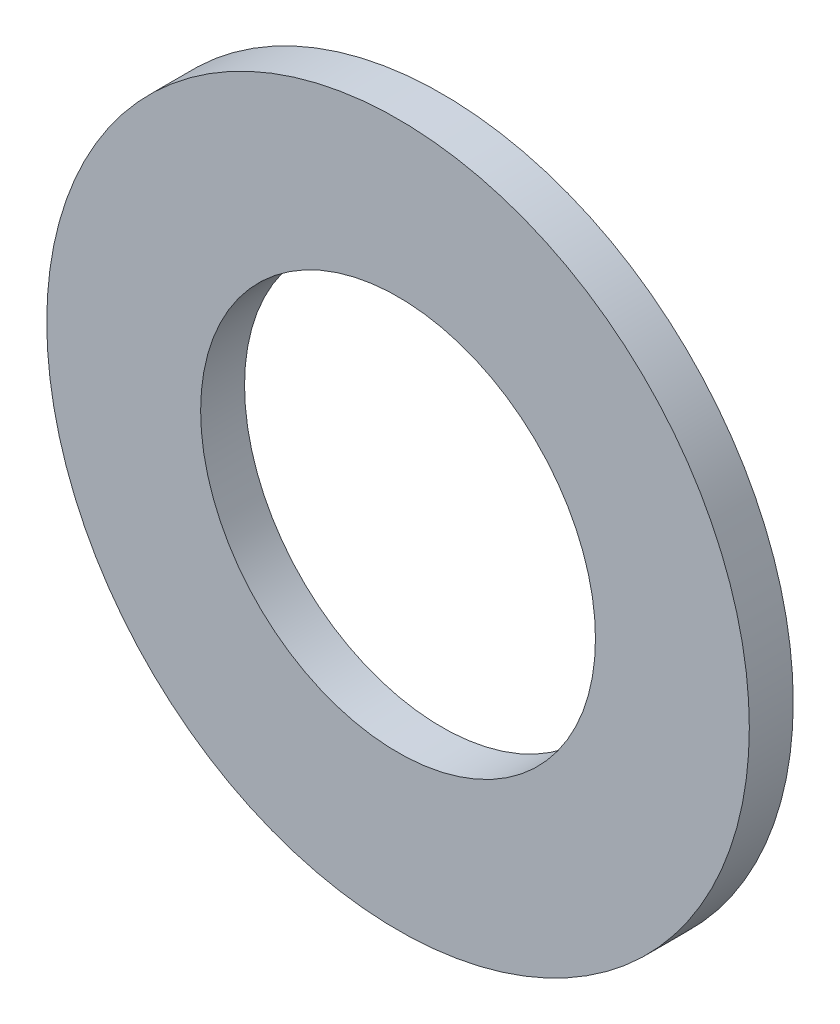
ISO-10303-21;
HEADER;
FILE_DESCRIPTION(('STEP AP214'),'2;1');
FILE_NAME('part.step','',(''),(''),'','','');
FILE_SCHEMA(('AUTOMOTIVE_DESIGN { 1 0 10303 214 1 1 1 1 }'));
ENDSEC;
DATA;
#1=APPLICATION_CONTEXT('core data for automotive mechanical design processes');
#2=APPLICATION_PROTOCOL_DEFINITION('international standard','automotive_design',2000,#1);
#3=PRODUCT_CONTEXT('',#1,'mechanical');
#4=PRODUCT('Part','Part','',(#3));
#5=PRODUCT_RELATED_PRODUCT_CATEGORY('part','',(#4));
#6=PRODUCT_DEFINITION_FORMATION('','',#4);
#7=PRODUCT_DEFINITION_CONTEXT('part definition',#1,'design');
#8=PRODUCT_DEFINITION('design','',#6,#7);
#9=PRODUCT_DEFINITION_SHAPE('','',#8);
#10=(LENGTH_UNIT() NAMED_UNIT(*) SI_UNIT(.MILLI.,.METRE.));
#11=(NAMED_UNIT(*) PLANE_ANGLE_UNIT() SI_UNIT($,.RADIAN.));
#12=(NAMED_UNIT(*) SI_UNIT($,.STERADIAN.) SOLID_ANGLE_UNIT());
#13=UNCERTAINTY_MEASURE_WITH_UNIT(LENGTH_MEASURE(1.E-05),#10,'distance_accuracy_value','');
#14=(GEOMETRIC_REPRESENTATION_CONTEXT(3) GLOBAL_UNCERTAINTY_ASSIGNED_CONTEXT((#13)) GLOBAL_UNIT_ASSIGNED_CONTEXT((#10,
#11,#12)) REPRESENTATION_CONTEXT('',''));
#15=CARTESIAN_POINT('',(0.,0.,0.));
#16=DIRECTION('',(0.,0.,1.));
#17=DIRECTION('',(1.,0.,0.));
#18=AXIS2_PLACEMENT_3D('',#15,#16,#17);
#19=CARTESIAN_POINT('',(0.,0.,-0.793750000000001));
#20=DIRECTION('',(0.,0.,1.));
#21=DIRECTION('',(1.,0.,0.));
#22=AXIS2_PLACEMENT_3D('',#19,#20,#21);
#23=CYLINDRICAL_SURFACE('',#22,12.7);
#24=CARTESIAN_POINT('',(0.,0.,-0.793750000000001));
#25=DIRECTION('',(0.,0.,1.));
#26=DIRECTION('',(1.,0.,0.));
#27=AXIS2_PLACEMENT_3D('',#24,#25,#26);
#28=CIRCLE('',#27,12.7);
#29=CARTESIAN_POINT('',(12.7,0.,-0.793750000000001));
#30=VERTEX_POINT('',#29);
#31=EDGE_CURVE('E10',#30,#30,#28,.T.);
#32=ORIENTED_EDGE('',*,*,#31,.T.);
#33=EDGE_LOOP('',(#32));
#34=FACE_BOUND('',#33,.T.);
#35=CARTESIAN_POINT('',(0.,0.,0.793749999999999));
#36=DIRECTION('',(0.,0.,1.));
#37=DIRECTION('',(1.,0.,0.));
#38=AXIS2_PLACEMENT_3D('',#35,#36,#37);
#39=CIRCLE('',#38,12.7);
#40=CARTESIAN_POINT('',(12.7,0.,0.793749999999999));
#41=VERTEX_POINT('',#40);
#42=EDGE_CURVE('E47',#41,#41,#39,.T.);
#43=ORIENTED_EDGE('',*,*,#42,.F.);
#44=EDGE_LOOP('',(#43));
#45=FACE_BOUND('',#44,.T.);
#46=ADVANCED_FACE('F37',(#34,#45),#23,.T.);
#47=CARTESIAN_POINT('',(0.,0.,-0.793750000000001));
#48=DIRECTION('',(0.,0.,1.));
#49=DIRECTION('',(1.,0.,0.));
#50=AXIS2_PLACEMENT_3D('',#47,#48,#49);
#51=PLANE('',#50);
#52=CARTESIAN_POINT('',(0.,0.,-0.793750000000001));
#53=DIRECTION('',(0.,0.,1.));
#54=DIRECTION('',(1.,0.,0.));
#55=AXIS2_PLACEMENT_3D('',#52,#53,#54);
#56=CIRCLE('',#55,7.1374);
#57=CARTESIAN_POINT('',(7.1374,0.,-0.793750000000001));
#58=VERTEX_POINT('',#57);
#59=EDGE_CURVE('E43',#58,#58,#56,.T.);
#60=ORIENTED_EDGE('',*,*,#59,.T.);
#61=EDGE_LOOP('',(#60));
#62=FACE_BOUND('',#61,.T.);
#63=ORIENTED_EDGE('',*,*,#31,.F.);
#64=EDGE_LOOP('',(#63));
#65=FACE_BOUND('',#64,.T.);
#66=ADVANCED_FACE('F66',(#62,#65),#51,.F.);
#67=CARTESIAN_POINT('',(0.,0.,-0.793750000000001));
#68=DIRECTION('',(0.,0.,1.));
#69=DIRECTION('',(1.,0.,0.));
#70=AXIS2_PLACEMENT_3D('',#67,#68,#69);
#71=CYLINDRICAL_SURFACE('',#70,7.1374);
#72=ORIENTED_EDGE('',*,*,#59,.F.);
#73=EDGE_LOOP('',(#72));
#74=FACE_BOUND('',#73,.T.);
#75=CARTESIAN_POINT('',(0.,0.,0.793749999999999));
#76=DIRECTION('',(0.,0.,1.));
#77=DIRECTION('',(1.,0.,0.));
#78=AXIS2_PLACEMENT_3D('',#75,#76,#77);
#79=CIRCLE('',#78,7.1374);
#80=CARTESIAN_POINT('',(7.1374,0.,0.793749999999999));
#81=VERTEX_POINT('',#80);
#82=EDGE_CURVE('E51',#81,#81,#79,.T.);
#83=ORIENTED_EDGE('',*,*,#82,.T.);
#84=EDGE_LOOP('',(#83));
#85=FACE_BOUND('',#84,.T.);
#86=ADVANCED_FACE('F57',(#74,#85),#71,.F.);
#87=CARTESIAN_POINT('',(0.,0.,0.793749999999999));
#88=DIRECTION('',(0.,0.,1.));
#89=DIRECTION('',(1.,0.,0.));
#90=AXIS2_PLACEMENT_3D('',#87,#88,#89);
#91=PLANE('',#90);
#92=ORIENTED_EDGE('',*,*,#42,.T.);
#93=EDGE_LOOP('',(#92));
#94=FACE_BOUND('',#93,.T.);
#95=ORIENTED_EDGE('',*,*,#82,.F.);
#96=EDGE_LOOP('',(#95));
#97=FACE_BOUND('',#96,.T.);
#98=ADVANCED_FACE('F59',(#94,#97),#91,.T.);
#99=CLOSED_SHELL('',(#46,#66,#86,#98));
#100=MANIFOLD_SOLID_BREP('B2',#99);
#101=ADVANCED_BREP_SHAPE_REPRESENTATION('',(#18,#100),#14);
#102=SHAPE_DEFINITION_REPRESENTATION(#9,#101);
ENDSEC;
END-ISO-10303-21;
